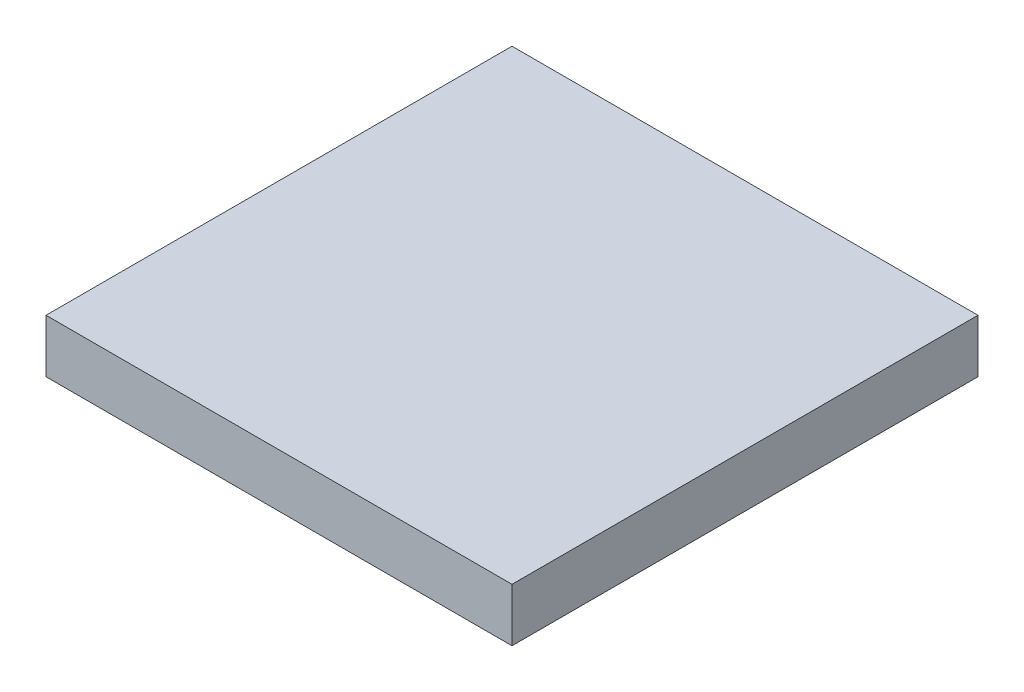
ISO-10303-21;
HEADER;
FILE_DESCRIPTION(('STEP AP214'),'2;1');
FILE_NAME('part.step','',(''),(''),'','','');
FILE_SCHEMA(('AUTOMOTIVE_DESIGN { 1 0 10303 214 1 1 1 1 }'));
ENDSEC;
DATA;
#1=APPLICATION_CONTEXT('core data for automotive mechanical design processes');
#2=APPLICATION_PROTOCOL_DEFINITION('international standard','automotive_design',2000,#1);
#3=PRODUCT_CONTEXT('',#1,'mechanical');
#4=PRODUCT('Part','Part','',(#3));
#5=PRODUCT_RELATED_PRODUCT_CATEGORY('part','',(#4));
#6=PRODUCT_DEFINITION_FORMATION('','',#4);
#7=PRODUCT_DEFINITION_CONTEXT('part definition',#1,'design');
#8=PRODUCT_DEFINITION('design','',#6,#7);
#9=PRODUCT_DEFINITION_SHAPE('','',#8);
#10=(LENGTH_UNIT() NAMED_UNIT(*) SI_UNIT(.MILLI.,.METRE.));
#11=(NAMED_UNIT(*) PLANE_ANGLE_UNIT() SI_UNIT($,.RADIAN.));
#12=(NAMED_UNIT(*) SI_UNIT($,.STERADIAN.) SOLID_ANGLE_UNIT());
#13=UNCERTAINTY_MEASURE_WITH_UNIT(LENGTH_MEASURE(1.E-05),#10,'distance_accuracy_value','');
#14=(GEOMETRIC_REPRESENTATION_CONTEXT(3) GLOBAL_UNCERTAINTY_ASSIGNED_CONTEXT((#13)) GLOBAL_UNIT_ASSIGNED_CONTEXT((#10,
#11,#12)) REPRESENTATION_CONTEXT('',''));
#15=CARTESIAN_POINT('',(0.,0.,0.));
#16=DIRECTION('',(0.,0.,1.));
#17=DIRECTION('',(1.,0.,0.));
#18=AXIS2_PLACEMENT_3D('',#15,#16,#17);
#19=CARTESIAN_POINT('',(-25.5294117647059,2.,-13.4509803921569));
#20=DIRECTION('',(1.,0.,0.));
#21=DIRECTION('',(0.,0.,-1.));
#22=AXIS2_PLACEMENT_3D('',#19,#20,#21);
#23=PLANE('',#22);
#24=DIRECTION('',(0.,0.,1.));
#25=VECTOR('',#24,1.);
#26=CARTESIAN_POINT('',(-25.5294117647059,0.,-13.4509803921569));
#27=LINE('',#26,#25);
#28=CARTESIAN_POINT('',(-25.5294117647059,0.,-13.4509803921569));
#29=VERTEX_POINT('',#28);
#30=CARTESIAN_POINT('',(-25.5294117647059,0.,4.04901960784314));
#31=VERTEX_POINT('',#30);
#32=EDGE_CURVE('E96',#29,#31,#27,.T.);
#33=ORIENTED_EDGE('',*,*,#32,.T.);
#34=DIRECTION('',(0.,-1.,0.));
#35=VECTOR('',#34,1.);
#36=CARTESIAN_POINT('',(-25.5294117647059,2.,4.04901960784314));
#37=LINE('',#36,#35);
#38=CARTESIAN_POINT('',(-25.5294117647059,2.,4.04901960784314));
#39=VERTEX_POINT('',#38);
#40=EDGE_CURVE('E11',#39,#31,#37,.T.);
#41=ORIENTED_EDGE('',*,*,#40,.F.);
#42=DIRECTION('',(0.,0.,1.));
#43=VECTOR('',#42,1.);
#44=CARTESIAN_POINT('',(-25.5294117647059,2.,-13.4509803921569));
#45=LINE('',#44,#43);
#46=CARTESIAN_POINT('',(-25.5294117647059,2.,-13.4509803921569));
#47=VERTEX_POINT('',#46);
#48=EDGE_CURVE('E84',#47,#39,#45,.T.);
#49=ORIENTED_EDGE('',*,*,#48,.F.);
#50=DIRECTION('',(0.,-1.,0.));
#51=VECTOR('',#50,1.);
#52=CARTESIAN_POINT('',(-25.5294117647059,2.,-13.4509803921569));
#53=LINE('',#52,#51);
#54=EDGE_CURVE('E92',#47,#29,#53,.T.);
#55=ORIENTED_EDGE('',*,*,#54,.T.);
#56=EDGE_LOOP('',(#33,#41,#49,#55));
#57=FACE_BOUND('',#56,.T.);
#58=ADVANCED_FACE('F33',(#57),#23,.F.);
#59=CARTESIAN_POINT('',(-25.5294117647059,2.,4.04901960784314));
#60=DIRECTION('',(0.,0.,-1.));
#61=DIRECTION('',(-1.,0.,0.));
#62=AXIS2_PLACEMENT_3D('',#59,#60,#61);
#63=PLANE('',#62);
#64=DIRECTION('',(1.,0.,0.));
#65=VECTOR('',#64,1.);
#66=CARTESIAN_POINT('',(-25.5294117647059,0.,4.04901960784314));
#67=LINE('',#66,#65);
#68=CARTESIAN_POINT('',(-8.02941176470587,0.,4.04901960784314));
#69=VERTEX_POINT('',#68);
#70=EDGE_CURVE('E88',#31,#69,#67,.T.);
#71=ORIENTED_EDGE('',*,*,#70,.T.);
#72=DIRECTION('',(0.,-1.,0.));
#73=VECTOR('',#72,1.);
#74=CARTESIAN_POINT('',(-8.02941176470587,2.,4.04901960784314));
#75=LINE('',#74,#73);
#76=CARTESIAN_POINT('',(-8.02941176470587,2.,4.04901960784314));
#77=VERTEX_POINT('',#76);
#78=EDGE_CURVE('E41',#77,#69,#75,.T.);
#79=ORIENTED_EDGE('',*,*,#78,.F.);
#80=DIRECTION('',(1.,0.,0.));
#81=VECTOR('',#80,1.);
#82=CARTESIAN_POINT('',(-25.5294117647059,2.,4.04901960784314));
#83=LINE('',#82,#81);
#84=EDGE_CURVE('E79',#39,#77,#83,.T.);
#85=ORIENTED_EDGE('',*,*,#84,.F.);
#86=ORIENTED_EDGE('',*,*,#40,.T.);
#87=EDGE_LOOP('',(#71,#79,#85,#86));
#88=FACE_BOUND('',#87,.T.);
#89=ADVANCED_FACE('F87',(#88),#63,.F.);
#90=CARTESIAN_POINT('',(-8.02941176470587,2.,-13.4509803921569));
#91=DIRECTION('',(-1.,0.,0.));
#92=DIRECTION('',(0.,0.,1.));
#93=AXIS2_PLACEMENT_3D('',#90,#91,#92);
#94=PLANE('',#93);
#95=DIRECTION('',(0.,0.,-1.));
#96=VECTOR('',#95,1.);
#97=CARTESIAN_POINT('',(-8.02941176470587,0.,-13.4509803921569));
#98=LINE('',#97,#96);
#99=CARTESIAN_POINT('',(-8.02941176470587,0.,-13.4509803921569));
#100=VERTEX_POINT('',#99);
#101=EDGE_CURVE('E66',#69,#100,#98,.T.);
#102=ORIENTED_EDGE('',*,*,#101,.T.);
#103=DIRECTION('',(0.,-1.,0.));
#104=VECTOR('',#103,1.);
#105=CARTESIAN_POINT('',(-8.02941176470587,2.,-13.4509803921569));
#106=LINE('',#105,#104);
#107=CARTESIAN_POINT('',(-8.02941176470587,2.,-13.4509803921569));
#108=VERTEX_POINT('',#107);
#109=EDGE_CURVE('E89',#108,#100,#106,.T.);
#110=ORIENTED_EDGE('',*,*,#109,.F.);
#111=DIRECTION('',(0.,0.,-1.));
#112=VECTOR('',#111,1.);
#113=CARTESIAN_POINT('',(-8.02941176470587,2.,-13.4509803921569));
#114=LINE('',#113,#112);
#115=EDGE_CURVE('E82',#77,#108,#114,.T.);
#116=ORIENTED_EDGE('',*,*,#115,.F.);
#117=ORIENTED_EDGE('',*,*,#78,.T.);
#118=EDGE_LOOP('',(#102,#110,#116,#117));
#119=FACE_BOUND('',#118,.T.);
#120=ADVANCED_FACE('F90',(#119),#94,.F.);
#121=CARTESIAN_POINT('',(-25.5294117647059,2.,-13.4509803921569));
#122=DIRECTION('',(0.,0.,1.));
#123=DIRECTION('',(1.,0.,0.));
#124=AXIS2_PLACEMENT_3D('',#121,#122,#123);
#125=PLANE('',#124);
#126=DIRECTION('',(-1.,0.,0.));
#127=VECTOR('',#126,1.);
#128=CARTESIAN_POINT('',(-25.5294117647059,0.,-13.4509803921569));
#129=LINE('',#128,#127);
#130=EDGE_CURVE('E72',#100,#29,#129,.T.);
#131=ORIENTED_EDGE('',*,*,#130,.T.);
#132=ORIENTED_EDGE('',*,*,#54,.F.);
#133=DIRECTION('',(-1.,0.,0.));
#134=VECTOR('',#133,1.);
#135=CARTESIAN_POINT('',(-25.5294117647059,2.,-13.4509803921569));
#136=LINE('',#135,#134);
#137=EDGE_CURVE('E49',#108,#47,#136,.T.);
#138=ORIENTED_EDGE('',*,*,#137,.F.);
#139=ORIENTED_EDGE('',*,*,#109,.T.);
#140=EDGE_LOOP('',(#131,#132,#138,#139));
#141=FACE_BOUND('',#140,.T.);
#142=ADVANCED_FACE('F103',(#141),#125,.F.);
#143=CARTESIAN_POINT('',(0.,2.,0.));
#144=DIRECTION('',(0.,1.,0.));
#145=DIRECTION('',(0.,0.,1.));
#146=AXIS2_PLACEMENT_3D('',#143,#144,#145);
#147=PLANE('',#146);
#148=ORIENTED_EDGE('',*,*,#48,.T.);
#149=ORIENTED_EDGE('',*,*,#84,.T.);
#150=ORIENTED_EDGE('',*,*,#115,.T.);
#151=ORIENTED_EDGE('',*,*,#137,.T.);
#152=EDGE_LOOP('',(#148,#149,#150,#151));
#153=FACE_BOUND('',#152,.T.);
#154=ADVANCED_FACE('F80',(#153),#147,.T.);
#155=CARTESIAN_POINT('',(0.,0.,0.));
#156=DIRECTION('',(0.,1.,0.));
#157=DIRECTION('',(0.,0.,1.));
#158=AXIS2_PLACEMENT_3D('',#155,#156,#157);
#159=PLANE('',#158);
#160=ORIENTED_EDGE('',*,*,#32,.F.);
#161=ORIENTED_EDGE('',*,*,#130,.F.);
#162=ORIENTED_EDGE('',*,*,#101,.F.);
#163=ORIENTED_EDGE('',*,*,#70,.F.);
#164=EDGE_LOOP('',(#160,#161,#162,#163));
#165=FACE_BOUND('',#164,.T.);
#166=ADVANCED_FACE('F106',(#165),#159,.F.);
#167=CLOSED_SHELL('',(#58,#89,#120,#142,#154,#166));
#168=MANIFOLD_SOLID_BREP('B2',#167);
#169=ADVANCED_BREP_SHAPE_REPRESENTATION('',(#18,#168),#14);
#170=SHAPE_DEFINITION_REPRESENTATION(#9,#169);
ENDSEC;
END-ISO-10303-21;
